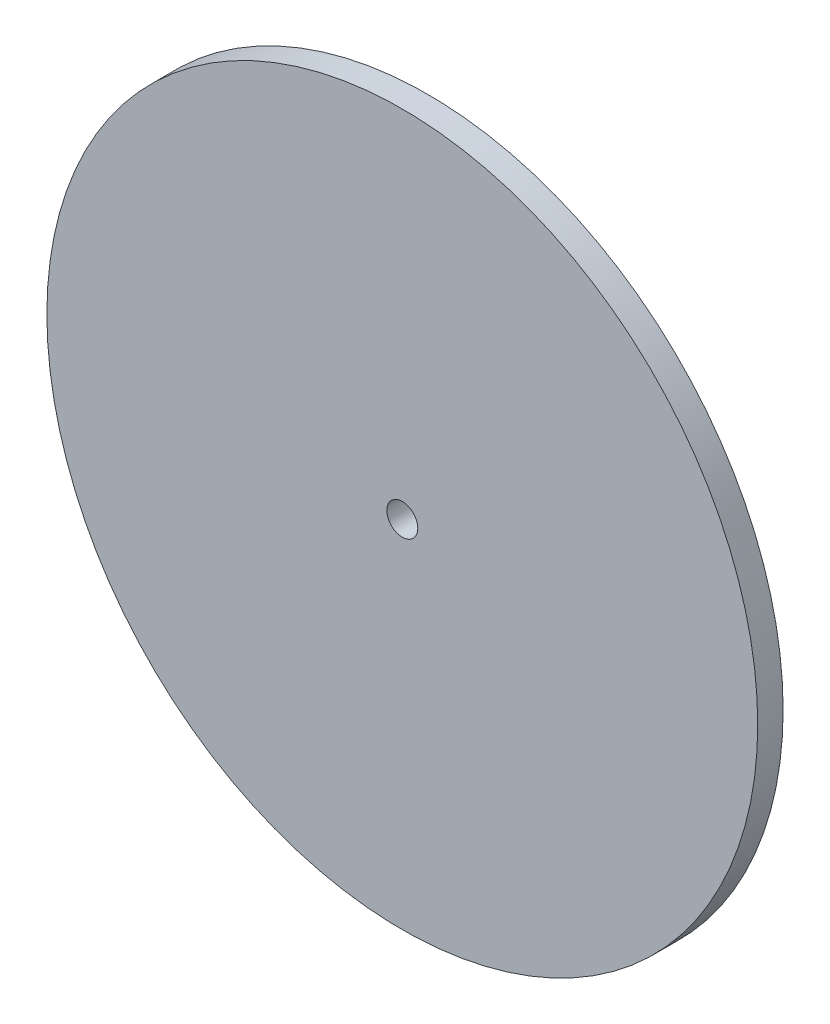
ISO-10303-21;
HEADER;
FILE_DESCRIPTION(('STEP AP214'),'2;1');
FILE_NAME('part.step','',(''),(''),'','','');
FILE_SCHEMA(('AUTOMOTIVE_DESIGN { 1 0 10303 214 1 1 1 1 }'));
ENDSEC;
DATA;
#1=APPLICATION_CONTEXT('core data for automotive mechanical design processes');
#2=APPLICATION_PROTOCOL_DEFINITION('international standard','automotive_design',2000,#1);
#3=PRODUCT_CONTEXT('',#1,'mechanical');
#4=PRODUCT('Part','Part','',(#3));
#5=PRODUCT_RELATED_PRODUCT_CATEGORY('part','',(#4));
#6=PRODUCT_DEFINITION_FORMATION('','',#4);
#7=PRODUCT_DEFINITION_CONTEXT('part definition',#1,'design');
#8=PRODUCT_DEFINITION('design','',#6,#7);
#9=PRODUCT_DEFINITION_SHAPE('','',#8);
#10=(LENGTH_UNIT() NAMED_UNIT(*) SI_UNIT(.MILLI.,.METRE.));
#11=(NAMED_UNIT(*) PLANE_ANGLE_UNIT() SI_UNIT($,.RADIAN.));
#12=(NAMED_UNIT(*) SI_UNIT($,.STERADIAN.) SOLID_ANGLE_UNIT());
#13=UNCERTAINTY_MEASURE_WITH_UNIT(LENGTH_MEASURE(1.E-05),#10,'distance_accuracy_value','');
#14=(GEOMETRIC_REPRESENTATION_CONTEXT(3) GLOBAL_UNCERTAINTY_ASSIGNED_CONTEXT((#13)) GLOBAL_UNIT_ASSIGNED_CONTEXT((#10,
#11,#12)) REPRESENTATION_CONTEXT('',''));
#15=CARTESIAN_POINT('',(0.,0.,0.));
#16=DIRECTION('',(0.,0.,1.));
#17=DIRECTION('',(1.,0.,0.));
#18=AXIS2_PLACEMENT_3D('',#15,#16,#17);
#19=CARTESIAN_POINT('',(0.,0.,5.));
#20=DIRECTION('',(0.,0.,1.));
#21=DIRECTION('',(1.,0.,0.));
#22=AXIS2_PLACEMENT_3D('',#19,#20,#21);
#23=PLANE('',#22);
#24=CARTESIAN_POINT('',(0.,0.,5.));
#25=DIRECTION('',(0.,0.,1.));
#26=DIRECTION('',(1.,0.,0.));
#27=AXIS2_PLACEMENT_3D('',#24,#25,#26);
#28=CIRCLE('',#27,70.);
#29=CARTESIAN_POINT('',(70.,0.,5.));
#30=VERTEX_POINT('',#29);
#31=EDGE_CURVE('E10',#30,#30,#28,.T.);
#32=ORIENTED_EDGE('',*,*,#31,.T.);
#33=EDGE_LOOP('',(#32));
#34=FACE_BOUND('',#33,.T.);
#35=CARTESIAN_POINT('',(0.,0.,5.));
#36=DIRECTION('',(0.,0.,1.));
#37=DIRECTION('',(1.,0.,0.));
#38=AXIS2_PLACEMENT_3D('',#35,#36,#37);
#39=CIRCLE('',#38,3.05);
#40=CARTESIAN_POINT('',(3.05,0.,5.));
#41=VERTEX_POINT('',#40);
#42=EDGE_CURVE('E41',#41,#41,#39,.T.);
#43=ORIENTED_EDGE('',*,*,#42,.F.);
#44=EDGE_LOOP('',(#43));
#45=FACE_BOUND('',#44,.T.);
#46=ADVANCED_FACE('F30',(#34,#45),#23,.T.);
#47=CARTESIAN_POINT('',(0.,0.,0.));
#48=DIRECTION('',(0.,0.,1.));
#49=DIRECTION('',(1.,0.,0.));
#50=AXIS2_PLACEMENT_3D('',#47,#48,#49);
#51=PLANE('',#50);
#52=CARTESIAN_POINT('',(0.,0.,0.));
#53=DIRECTION('',(0.,0.,1.));
#54=DIRECTION('',(1.,0.,0.));
#55=AXIS2_PLACEMENT_3D('',#52,#53,#54);
#56=CIRCLE('',#55,70.);
#57=CARTESIAN_POINT('',(70.,0.,0.));
#58=VERTEX_POINT('',#57);
#59=EDGE_CURVE('E34',#58,#58,#56,.T.);
#60=ORIENTED_EDGE('',*,*,#59,.F.);
#61=EDGE_LOOP('',(#60));
#62=FACE_BOUND('',#61,.T.);
#63=CARTESIAN_POINT('',(0.,0.,0.));
#64=DIRECTION('',(0.,0.,1.));
#65=DIRECTION('',(1.,0.,0.));
#66=AXIS2_PLACEMENT_3D('',#63,#64,#65);
#67=CIRCLE('',#66,3.05);
#68=CARTESIAN_POINT('',(3.05,0.,0.));
#69=VERTEX_POINT('',#68);
#70=EDGE_CURVE('E43',#69,#69,#67,.T.);
#71=ORIENTED_EDGE('',*,*,#70,.T.);
#72=EDGE_LOOP('',(#71));
#73=FACE_BOUND('',#72,.T.);
#74=ADVANCED_FACE('F53',(#62,#73),#51,.F.);
#75=CARTESIAN_POINT('',(0.,0.,5.));
#76=DIRECTION('',(0.,0.,-1.));
#77=DIRECTION('',(-1.,0.,0.));
#78=AXIS2_PLACEMENT_3D('',#75,#76,#77);
#79=CYLINDRICAL_SURFACE('',#78,70.);
#80=ORIENTED_EDGE('',*,*,#31,.F.);
#81=EDGE_LOOP('',(#80));
#82=FACE_BOUND('',#81,.T.);
#83=ORIENTED_EDGE('',*,*,#59,.T.);
#84=EDGE_LOOP('',(#83));
#85=FACE_BOUND('',#84,.T.);
#86=ADVANCED_FACE('F32',(#82,#85),#79,.T.);
#87=CARTESIAN_POINT('',(0.,0.,5.));
#88=DIRECTION('',(0.,0.,-1.));
#89=DIRECTION('',(-1.,0.,0.));
#90=AXIS2_PLACEMENT_3D('',#87,#88,#89);
#91=CYLINDRICAL_SURFACE('',#90,3.05);
#92=ORIENTED_EDGE('',*,*,#42,.T.);
#93=EDGE_LOOP('',(#92));
#94=FACE_BOUND('',#93,.T.);
#95=ORIENTED_EDGE('',*,*,#70,.F.);
#96=EDGE_LOOP('',(#95));
#97=FACE_BOUND('',#96,.T.);
#98=ADVANCED_FACE('F49',(#94,#97),#91,.F.);
#99=CLOSED_SHELL('',(#46,#74,#86,#98));
#100=MANIFOLD_SOLID_BREP('B2',#99);
#101=ADVANCED_BREP_SHAPE_REPRESENTATION('',(#18,#100),#14);
#102=SHAPE_DEFINITION_REPRESENTATION(#9,#101);
ENDSEC;
END-ISO-10303-21;
